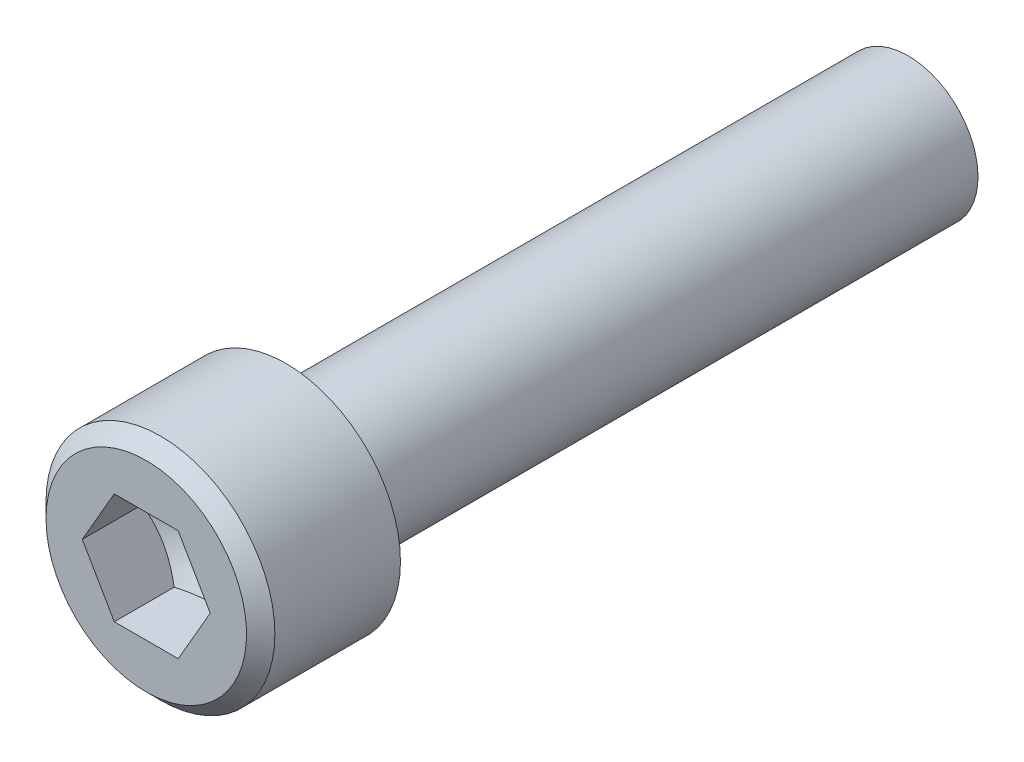
ISO-10303-21;
HEADER;
FILE_DESCRIPTION(('STEP AP214'),'2;1');
FILE_NAME('part.step','',(''),(''),'','','');
FILE_SCHEMA(('AUTOMOTIVE_DESIGN { 1 0 10303 214 1 1 1 1 }'));
ENDSEC;
DATA;
#1=APPLICATION_CONTEXT('core data for automotive mechanical design processes');
#2=APPLICATION_PROTOCOL_DEFINITION('international standard','automotive_design',2000,#1);
#3=PRODUCT_CONTEXT('',#1,'mechanical');
#4=PRODUCT('Part','Part','',(#3));
#5=PRODUCT_RELATED_PRODUCT_CATEGORY('part','',(#4));
#6=PRODUCT_DEFINITION_FORMATION('','',#4);
#7=PRODUCT_DEFINITION_CONTEXT('part definition',#1,'design');
#8=PRODUCT_DEFINITION('design','',#6,#7);
#9=PRODUCT_DEFINITION_SHAPE('','',#8);
#10=(LENGTH_UNIT() NAMED_UNIT(*) SI_UNIT(.MILLI.,.METRE.));
#11=(NAMED_UNIT(*) PLANE_ANGLE_UNIT() SI_UNIT($,.RADIAN.));
#12=(NAMED_UNIT(*) SI_UNIT($,.STERADIAN.) SOLID_ANGLE_UNIT());
#13=UNCERTAINTY_MEASURE_WITH_UNIT(LENGTH_MEASURE(1.E-05),#10,'distance_accuracy_value','');
#14=(GEOMETRIC_REPRESENTATION_CONTEXT(3) GLOBAL_UNCERTAINTY_ASSIGNED_CONTEXT((#13)) GLOBAL_UNIT_ASSIGNED_CONTEXT((#10,
#11,#12)) REPRESENTATION_CONTEXT('',''));
#15=CARTESIAN_POINT('',(0.,0.,0.));
#16=DIRECTION('',(0.,0.,1.));
#17=DIRECTION('',(1.,0.,0.));
#18=AXIS2_PLACEMENT_3D('',#15,#16,#17);
#19=CARTESIAN_POINT('',(0.,0.,2.00922230834522));
#20=DIRECTION('',(0.,0.,1.));
#21=DIRECTION('',(1.,0.,0.));
#22=AXIS2_PLACEMENT_3D('',#19,#20,#21);
#23=CONICAL_SURFACE('',#22,1.61357492368097,1.04719755087501);
#24=CARTESIAN_POINT('',(2.8421709430404E-10,0.,1.07762439154158));
#25=VERTEX_POINT('',#24);
#26=VERTEX_LOOP('',#25);
#27=FACE_BOUND('',#26,.T.);
#28=CARTESIAN_POINT('',(1.60395121657074,-3.93231520287804E-11,2.00366605844938));
#29=CARTESIAN_POINT('',(1.56870924553933,-0.0610408844234655,1.98331319876982));
#30=CARTESIAN_POINT('',(1.53316306631527,-0.122608672854029,1.96480333807968));
#31=CARTESIAN_POINT('',(1.46145524955302,-0.24681025478575,1.93249493217423));
#32=CARTESIAN_POINT('',(1.42529233832048,-0.309446254390239,1.91870781520045));
#33=CARTESIAN_POINT('',(1.35341466465201,-0.433942037113966,1.89724717363123));
#34=CARTESIAN_POINT('',(1.3177109584191,-0.495782670327854,1.88943079992379));
#35=CARTESIAN_POINT('',(1.24613563586373,-0.619754765561854,1.88010142592249));
#36=CARTESIAN_POINT('',(1.2102642795196,-0.681885777286306,1.87858069824715));
#37=CARTESIAN_POINT('',(1.14324250260176,-0.79797090012157,1.88175241126181));
#38=CARTESIAN_POINT('',(1.11208202485472,-0.851942430767562,1.88566609057263));
#39=CARTESIAN_POINT('',(1.04996406966679,-0.95953388521534,1.89806764845493));
#40=CARTESIAN_POINT('',(1.01900680691482,-1.013153437165,1.90655975922625));
#41=CARTESIAN_POINT('',(0.956760882889259,-1.12096654014135,1.92778839251887));
#42=CARTESIAN_POINT('',(0.925480095700149,-1.17514645285364,1.94061485982907));
#43=CARTESIAN_POINT('',(0.863384939234646,-1.28269841875583,1.96972551820593));
#44=CARTESIAN_POINT('',(0.832569775061635,-1.33607184874706,1.98600287381941));
#45=CARTESIAN_POINT('',(0.801975658015311,-1.389062413884,2.00366602975759));
#46=B_SPLINE_CURVE_WITH_KNOTS('',3,(#28,#29,#30,#31,#32,#33,#34,#35,#36,#37,#38,#39,#40,#41,#42,
#43,#44,#45),.UNSPECIFIED.,.F.,.F.,(4,2,2,2,2,2,2,2,4),(0.,0.220177526699982,0.440884143066922,
0.656128954539431,0.871109492448446,1.05826264577387,1.24558909665781,1.43706954981636,
1.62817420782779),.UNSPECIFIED.);
#47=CARTESIAN_POINT('',(1.60395121651482,0.,2.00366605835813));
#48=VERTEX_POINT('',#47);
#49=CARTESIAN_POINT('',(0.801975633155763,-1.389062456942,2.00366604411025));
#50=VERTEX_POINT('',#49);
#51=EDGE_CURVE('E21',#48,#50,#46,.T.);
#52=ORIENTED_EDGE('',*,*,#51,.F.);
#53=CARTESIAN_POINT('',(1.60395121657095,3.83074814970818E-11,2.00366605844988));
#54=CARTESIAN_POINT('',(1.56870924552077,0.0610408844553845,1.98331319875935));
#55=CARTESIAN_POINT('',(1.53316306627758,0.122608672919246,1.96480333806014));
#56=CARTESIAN_POINT('',(1.46145524947397,0.246810254922725,1.93249493214117));
#57=CARTESIAN_POINT('',(1.42529233821916,0.309446254565738,1.91870781516328));
#58=CARTESIAN_POINT('',(1.3534146645473,0.433942037295318,1.89724717360671));
#59=CARTESIAN_POINT('',(1.31771095833377,0.495782670475642,1.88943079990936));
#60=CARTESIAN_POINT('',(1.24613563582068,0.619754765636425,1.88010142592018));
#61=CARTESIAN_POINT('',(1.21026427949945,0.681885777321209,1.87858069824653));
#62=CARTESIAN_POINT('',(1.14324249767597,0.797970908653282,1.88175241149628));
#63=CARTESIAN_POINT('',(1.11208201501096,0.851942447817442,1.88566609181346));
#64=CARTESIAN_POINT('',(1.04996405006882,0.959533919160014,1.898067653093));
#65=CARTESIAN_POINT('',(1.0190067824808,1.01315347948597,1.90655976625848));
#66=CARTESIAN_POINT('',(0.956760848671186,1.12096659940879,1.92778840552082));
#67=CARTESIAN_POINT('',(0.925480056538882,1.17514652068294,1.94061487644981));
#68=CARTESIAN_POINT('',(0.863384890366848,1.28269850339733,1.9697255428513));
#69=CARTESIAN_POINT('',(0.832569721429848,1.33607194164004,1.98600290286582));
#70=CARTESIAN_POINT('',(0.80197559968634,1.38906251491274,2.00366606343383));
#71=B_SPLINE_CURVE_WITH_KNOTS('',3,(#53,#54,#55,#56,#57,#58,#59,#60,#61,#62,#63,#64,#65,#66,#67,
#68,#69,#70),.UNSPECIFIED.,.F.,.F.,(4,2,2,2,2,2,2,2,4),(0.,0.22017752681814,0.440884143318391,
0.656128954670925,0.871109492448965,1.05826267532404,1.24558915586695,1.43706964022464,
1.62817432919767),.UNSPECIFIED.);
#72=CARTESIAN_POINT('',(0.801975603520193,1.38906250827231,2.00366606122035));
#73=VERTEX_POINT('',#72);
#74=EDGE_CURVE('E86',#48,#73,#71,.T.);
#75=ORIENTED_EDGE('',*,*,#74,.T.);
#76=CARTESIAN_POINT('',(0.801975572332661,1.3890625,2.00366604808113));
#77=CARTESIAN_POINT('',(0.731491630827418,1.3890625,1.98331318923872));
#78=CARTESIAN_POINT('',(0.660399272939518,1.3890625,1.96480332944128));
#79=CARTESIAN_POINT('',(0.516983640587039,1.3890625,1.93249492539564));
#80=CARTESIAN_POINT('',(0.444657818734046,1.3890625,1.91870780938823));
#81=CARTESIAN_POINT('',(0.300902472702479,1.3890625,1.89724716975661));
#82=CARTESIAN_POINT('',(0.229495060928604,1.3890625,1.88943079701753));
#83=CARTESIAN_POINT('',(0.0863444172851924,1.3890625,1.88010142487821));
#84=CARTESIAN_POINT('',(0.0146017053721718,1.3890625,1.87858069809685));
#85=CARTESIAN_POINT('',(-0.119441855224592,1.3890625,1.88175241282815));
#86=CARTESIAN_POINT('',(-0.181762818246063,1.3890625,1.88566609362759));
#87=CARTESIAN_POINT('',(-0.305998743505769,1.3890625,1.89806765548551));
#88=CARTESIAN_POINT('',(-0.36791327636582,1.3890625,1.90655976874626));
#89=CARTESIAN_POINT('',(-0.492405139270699,1.3890625,1.92778840784305));
#90=CARTESIAN_POINT('',(-0.55496672113869,1.3890625,1.94061487849877));
#91=CARTESIAN_POINT('',(-0.679157048763347,1.3890625,1.96972554406884));
#92=CARTESIAN_POINT('',(-0.740787384314304,1.3890625,1.98600290352636));
#93=CARTESIAN_POINT('',(-0.801975625514881,1.3890625,2.00366606343352));
#94=B_SPLINE_CURVE_WITH_KNOTS('',3,(#76,#77,#78,#79,#80,#81,#82,#83,#84,#85,#86,#87,#88,#89,#90,
#91,#92,#93),.UNSPECIFIED.,.F.,.F.,(4,2,2,2,2,2,2,2,4),(0.,0.220177524395235,0.440884138409889,
0.656128947501183,0.871109483041436,1.05826265911873,1.24558913283762,1.43706961000139,
1.62817429182646),.UNSPECIFIED.);
#95=CARTESIAN_POINT('',(-0.801975617847664,1.38906249999999,2.00366606122018));
#96=VERTEX_POINT('',#95);
#97=EDGE_CURVE('E110',#73,#96,#94,.T.);
#98=ORIENTED_EDGE('',*,*,#97,.T.);
#99=CARTESIAN_POINT('',(-0.801975626276859,1.38906246885661,2.00366604808179));
#100=CARTESIAN_POINT('',(-0.837217597026695,1.32802158495904,1.98331318924093));
#101=CARTESIAN_POINT('',(-0.872763775967825,1.26645379701807,1.96480332944475));
#102=CARTESIAN_POINT('',(-0.944471592137981,1.14225221611155,1.93249492540098));
#103=CARTESIAN_POINT('',(-0.98063450306121,1.07961621704293,1.91870780939412));
#104=CARTESIAN_POINT('',(-1.05251217607654,0.955120435450555,1.8972471697605));
#105=CARTESIAN_POINT('',(-1.08821588196637,0.893279802830876,1.88943079701986));
#106=CARTESIAN_POINT('',(-1.15979120379438,0.769307708856671,1.88010142487863));
#107=CARTESIAN_POINT('',(-1.1956625597543,0.707176697797693,1.87858069809695));
#108=CARTESIAN_POINT('',(-1.26268433932696,0.591091570364156,1.88175241279337));
#109=CARTESIAN_POINT('',(-1.29384482011013,0.537120034459436,1.88566609344389));
#110=CARTESIAN_POINT('',(-1.35596278129694,0.429528569621292,1.89806765479912));
#111=CARTESIAN_POINT('',(-1.38692004701152,0.375909012540234,1.90655976770563));
#112=CARTESIAN_POINT('',(-1.4491659770165,0.268095899207226,1.92778840591918));
#113=CARTESIAN_POINT('',(-1.4804467672192,0.213915981275251,1.94061487603949));
#114=CARTESIAN_POINT('',(-1.54254192959554,0.106364005135186,1.96972554042232));
#115=CARTESIAN_POINT('',(-1.57335709666624,0.0529905701250223,1.98600289922871));
#116=CARTESIAN_POINT('',(-1.60395121657162,3.60392163694603E-11,2.0036660584509));
#117=B_SPLINE_CURVE_WITH_KNOTS('',3,(#99,#100,#101,#102,#103,#104,#105,#106,#107,#108,#109,#110,
#111,#112,#113,#114,#115,#116),.UNSPECIFIED.,.F.,.F.,(4,2,2,2,2,2,2,2,4),(0.,0.220177524377925,
0.44088413837303,0.656128947482232,0.871109483042021,1.05826265474771,1.24558912407881,
1.43706959662696,1.62817427387154),.UNSPECIFIED.);
#118=CARTESIAN_POINT('',(-1.60395121667412,1.94474958337601E-11,2.00366605856033));
#119=VERTEX_POINT('',#118);
#120=EDGE_CURVE('E204',#96,#119,#117,.T.);
#121=ORIENTED_EDGE('',*,*,#120,.T.);
#122=CARTESIAN_POINT('',(-0.801975545805903,-1.38906253324149,2.00366610034259));
#123=CARTESIAN_POINT('',(-0.837217537376201,-1.32802166134192,1.98331322384176));
#124=CARTESIAN_POINT('',(-0.87276372600438,-1.26645387633831,1.96480335498118));
#125=CARTESIAN_POINT('',(-0.94447155170889,-1.14225229337312,1.93249494059084));
#126=CARTESIAN_POINT('',(-0.980634462454542,-1.07961628929142,1.91870782330784));
#127=CARTESIAN_POINT('',(-1.05251213761926,-0.955120500192236,1.89724717950107));
#128=CARTESIAN_POINT('',(-1.08821584576458,-0.893279865036186,1.88943080386541));
#129=CARTESIAN_POINT('',(-1.15979117156361,-0.769307765179402,1.88010142695925));
#130=CARTESIAN_POINT('',(-1.19566252924003,-0.707176750774704,1.87858069831366));
#131=CARTESIAN_POINT('',(-1.26268431290894,-0.59109161601293,1.88175241009377));
#132=CARTESIAN_POINT('',(-1.29384479603855,-0.537120076123377,1.8856660897217));
#133=CARTESIAN_POINT('',(-1.3559627618584,-0.429528603319139,1.89806764983324));
#134=CARTESIAN_POINT('',(-1.38692002985971,-0.375909042256496,1.90655976251606));
#135=CARTESIAN_POINT('',(-1.44916596465683,-0.268095920606171,1.92778840102818));
#136=CARTESIAN_POINT('',(-1.48044675736197,-0.213915998344159,1.94061487171226));
#137=CARTESIAN_POINT('',(-1.54254192470765,-0.106364013605571,1.96972553783737));
#138=CARTESIAN_POINT('',(-1.57335709424496,-0.0529905743274037,1.98600289782452));
#139=CARTESIAN_POINT('',(-1.60395121657306,-3.35542596660389E-11,2.00366605845173));
#140=B_SPLINE_CURVE_WITH_KNOTS('',3,(#122,#123,#124,#125,#126,#127,#128,#129,#130,#131,#132,
#133,#134,#135,#136,#137,#138,#139),.UNSPECIFIED.,.F.,.F.,(4,2,2,2,2,2,2,2,4),(0.,
0.220177537854373,0.440884164774705,0.65612898490866,0.871109531728061,1.0582627170637,
1.24558919990149,1.43706968745937,1.62817437987301),.UNSPECIFIED.);
#141=CARTESIAN_POINT('',(-0.801975558576624,-1.3890625,2.00366604411011));
#142=VERTEX_POINT('',#141);
#143=EDGE_CURVE('E125',#142,#119,#140,.T.);
#144=ORIENTED_EDGE('',*,*,#143,.F.);
#145=CARTESIAN_POINT('',(0.801975668346452,-1.38906246250606,2.00366610034524));
#146=CARTESIAN_POINT('',(0.731491726858987,-1.38906248653386,1.98331322385465));
#147=CARTESIAN_POINT('',(0.660399366709517,-1.38906249639085,1.96480335500192));
#148=CARTESIAN_POINT('',(0.516983727889385,-1.38906250361783,1.93249494062263));
#149=CARTESIAN_POINT('',(0.444657901828066,-1.38906250095775,1.91870782334253));
#150=CARTESIAN_POINT('',(0.30090254822708,-1.38906249906595,1.89724717952394));
#151=CARTESIAN_POINT('',(0.2294951330899,-1.38906249975102,1.88943080387923));
#152=CARTESIAN_POINT('',(0.0863444822814701,-1.38906250024869,1.88010142696181));
#153=CARTESIAN_POINT('',(0.014601766566663,-1.38906250006237,1.87858069831428));
#154=CARTESIAN_POINT('',(-0.11944179261487,-1.38906249994571,1.88175240989325));
#155=CARTESIAN_POINT('',(-0.181762750425798,-1.38906249998537,1.88566608866343));
#156=CARTESIAN_POINT('',(-0.305998665394859,-1.38906250001465,1.89806764587998));
#157=CARTESIAN_POINT('',(-0.367913193175539,-1.38906250000423,1.90655975652276));
#158=CARTESIAN_POINT('',(-0.492405046113857,-1.38906249999569,1.92778838994837));
#159=CARTESIAN_POINT('',(-0.554966623097846,-1.38906249999785,1.94061485754914));
#160=CARTESIAN_POINT('',(-0.679156941243086,-1.38906250000216,1.96972551683718));
#161=CARTESIAN_POINT('',(-0.740787272196769,-1.3890625000043,1.98600287307466));
#162=CARTESIAN_POINT('',(-0.801975508857035,-1.3890625,2.0036660297573));
#163=B_SPLINE_CURVE_WITH_KNOTS('',3,(#145,#146,#147,#148,#149,#150,#151,#152,#153,#154,#155,
#156,#157,#158,#159,#160,#161,#162),.UNSPECIFIED.,.F.,.F.,(4,2,2,2,2,2,2,2,4),(0.,
0.220177537754302,0.440884164561744,0.656128984798626,0.871109531730289,1.05826269189142,
1.24558914946159,1.43706961043964,1.62817427647582),.UNSPECIFIED.);
#164=EDGE_CURVE('E89',#50,#142,#163,.T.);
#165=ORIENTED_EDGE('',*,*,#164,.F.);
#166=EDGE_LOOP('',(#52,#75,#98,#121,#144,#165));
#167=FACE_BOUND('',#166,.T.);
#168=ADVANCED_FACE('F17',(#27,#167),#23,.F.);
#169=CARTESIAN_POINT('',(-1.60395121659243,0.,-15.876));
#170=DIRECTION('',(-0.866025403784438,-0.5,0.));
#171=DIRECTION('',(0.5,-0.866025403784438,0.));
#172=AXIS2_PLACEMENT_3D('',#169,#170,#171);
#173=PLANE('',#172);
#174=ORIENTED_EDGE('',*,*,#143,.T.);
#175=DIRECTION('',(0.,0.,1.));
#176=VECTOR('',#175,1.);
#177=CARTESIAN_POINT('',(-1.60395121658915,5.67536469209262E-12,-15.876));
#178=LINE('',#177,#176);
#179=CARTESIAN_POINT('',(-1.60395121658915,5.67579837296162E-12,3.50520000000001));
#180=VERTEX_POINT('',#179);
#181=EDGE_CURVE('E178',#119,#180,#178,.T.);
#182=ORIENTED_EDGE('',*,*,#181,.T.);
#183=DIRECTION('',(0.5,-0.866025403784439,0.));
#184=VECTOR('',#183,1.);
#185=CARTESIAN_POINT('',(-1.60395121659243,0.,3.5052));
#186=LINE('',#185,#184);
#187=CARTESIAN_POINT('',(-0.801975608296548,-1.38906249999971,3.5052));
#188=VERTEX_POINT('',#187);
#189=EDGE_CURVE('E174',#180,#188,#186,.T.);
#190=ORIENTED_EDGE('',*,*,#189,.T.);
#191=DIRECTION('',(0.,0.,1.));
#192=VECTOR('',#191,1.);
#193=CARTESIAN_POINT('',(-0.801975608296213,-1.3890625,-15.876));
#194=LINE('',#193,#192);
#195=EDGE_CURVE('E153',#188,#142,#194,.F.);
#196=ORIENTED_EDGE('',*,*,#195,.T.);
#197=EDGE_LOOP('',(#174,#182,#190,#196));
#198=FACE_BOUND('',#197,.T.);
#199=ADVANCED_FACE('F141',(#198),#173,.F.);
#200=CARTESIAN_POINT('',(-0.801975608296214,-1.3890625,-15.876));
#201=DIRECTION('',(0.,-1.,0.));
#202=DIRECTION('',(1.,0.,0.));
#203=AXIS2_PLACEMENT_3D('',#200,#201,#202);
#204=PLANE('',#203);
#205=ORIENTED_EDGE('',*,*,#164,.T.);
#206=ORIENTED_EDGE('',*,*,#195,.F.);
#207=DIRECTION('',(-1.,0.,0.));
#208=VECTOR('',#207,1.);
#209=CARTESIAN_POINT('',(0.,-1.38906250000001,3.5052));
#210=LINE('',#209,#208);
#211=CARTESIAN_POINT('',(0.801975608295964,-1.38906250000044,3.50520000000001));
#212=VERTEX_POINT('',#211);
#213=EDGE_CURVE('E177',#188,#212,#210,.F.);
#214=ORIENTED_EDGE('',*,*,#213,.T.);
#215=DIRECTION('',(0.,0.,1.));
#216=VECTOR('',#215,1.);
#217=CARTESIAN_POINT('',(0.801975608296215,-1.3890625,-15.876));
#218=LINE('',#217,#216);
#219=EDGE_CURVE('E100',#212,#50,#218,.F.);
#220=ORIENTED_EDGE('',*,*,#219,.T.);
#221=EDGE_LOOP('',(#205,#206,#214,#220));
#222=FACE_BOUND('',#221,.T.);
#223=ADVANCED_FACE('F138',(#222),#204,.F.);
#224=CARTESIAN_POINT('',(0.801975608296216,-1.3890625,-15.876));
#225=DIRECTION('',(0.866025403784439,-0.5,0.));
#226=DIRECTION('',(0.5,0.866025403784439,0.));
#227=AXIS2_PLACEMENT_3D('',#224,#225,#226);
#228=PLANE('',#227);
#229=ORIENTED_EDGE('',*,*,#51,.T.);
#230=ORIENTED_EDGE('',*,*,#219,.F.);
#231=DIRECTION('',(0.499999999999999,0.866025403784439,0.));
#232=VECTOR('',#231,1.);
#233=CARTESIAN_POINT('',(0.801975608296216,-1.3890625,3.5052));
#234=LINE('',#233,#232);
#235=CARTESIAN_POINT('',(1.60395121659421,-3.08534791623605E-12,3.5052));
#236=VERTEX_POINT('',#235);
#237=EDGE_CURVE('E97',#212,#236,#234,.T.);
#238=ORIENTED_EDGE('',*,*,#237,.T.);
#239=DIRECTION('',(0.,0.,1.));
#240=VECTOR('',#239,1.);
#241=CARTESIAN_POINT('',(1.60395121659243,0.,-15.876));
#242=LINE('',#241,#240);
#243=EDGE_CURVE('E94',#236,#48,#242,.F.);
#244=ORIENTED_EDGE('',*,*,#243,.T.);
#245=EDGE_LOOP('',(#229,#230,#238,#244));
#246=FACE_BOUND('',#245,.T.);
#247=ADVANCED_FACE('F95',(#246),#228,.F.);
#248=CARTESIAN_POINT('',(1.60395121659243,0.,-15.876));
#249=DIRECTION('',(0.866025403784438,0.5,0.));
#250=DIRECTION('',(-0.5,0.866025403784438,0.));
#251=AXIS2_PLACEMENT_3D('',#248,#249,#250);
#252=PLANE('',#251);
#253=ORIENTED_EDGE('',*,*,#74,.F.);
#254=ORIENTED_EDGE('',*,*,#243,.F.);
#255=DIRECTION('',(-0.5,0.866025403784438,0.));
#256=VECTOR('',#255,1.);
#257=CARTESIAN_POINT('',(1.60395121659243,0.,3.5052));
#258=LINE('',#257,#256);
#259=CARTESIAN_POINT('',(0.8019756051891,1.3890625,3.5052));
#260=VERTEX_POINT('',#259);
#261=EDGE_CURVE('E183',#236,#260,#258,.T.);
#262=ORIENTED_EDGE('',*,*,#261,.T.);
#263=DIRECTION('',(0.,0.,1.));
#264=VECTOR('',#263,1.);
#265=CARTESIAN_POINT('',(0.801975608296215,1.3890625,-15.876));
#266=LINE('',#265,#264);
#267=EDGE_CURVE('E103',#260,#73,#266,.F.);
#268=ORIENTED_EDGE('',*,*,#267,.T.);
#269=EDGE_LOOP('',(#253,#254,#262,#268));
#270=FACE_BOUND('',#269,.T.);
#271=ADVANCED_FACE('F102',(#270),#252,.F.);
#272=CARTESIAN_POINT('',(0.801975608296215,1.3890625,-15.876));
#273=DIRECTION('',(0.,1.,0.));
#274=DIRECTION('',(0.,0.,1.));
#275=AXIS2_PLACEMENT_3D('',#272,#273,#274);
#276=PLANE('',#275);
#277=ORIENTED_EDGE('',*,*,#97,.F.);
#278=ORIENTED_EDGE('',*,*,#267,.F.);
#279=DIRECTION('',(-1.,0.,0.));
#280=VECTOR('',#279,1.);
#281=CARTESIAN_POINT('',(0.,1.3890625,3.5052));
#282=LINE('',#281,#280);
#283=CARTESIAN_POINT('',(-0.801975609849683,1.38906249730931,3.50520000000001));
#284=VERTEX_POINT('',#283);
#285=EDGE_CURVE('E46',#260,#284,#282,.T.);
#286=ORIENTED_EDGE('',*,*,#285,.T.);
#287=DIRECTION('',(0.,0.,1.));
#288=VECTOR('',#287,1.);
#289=CARTESIAN_POINT('',(-0.801975608296228,1.38906249999998,-15.876));
#290=LINE('',#289,#288);
#291=EDGE_CURVE('E209',#284,#96,#290,.F.);
#292=ORIENTED_EDGE('',*,*,#291,.T.);
#293=EDGE_LOOP('',(#277,#278,#286,#292));
#294=FACE_BOUND('',#293,.T.);
#295=ADVANCED_FACE('F132',(#294),#276,.F.);
#296=CARTESIAN_POINT('',(-0.801975608296216,1.3890625,-15.876));
#297=DIRECTION('',(-0.866025403784439,0.5,0.));
#298=DIRECTION('',(-0.5,-0.866025403784439,0.));
#299=AXIS2_PLACEMENT_3D('',#296,#297,#298);
#300=PLANE('',#299);
#301=ORIENTED_EDGE('',*,*,#120,.F.);
#302=ORIENTED_EDGE('',*,*,#291,.F.);
#303=DIRECTION('',(-0.499999999999999,-0.866025403784439,0.));
#304=VECTOR('',#303,1.);
#305=CARTESIAN_POINT('',(-0.801975608296228,1.38906249999998,3.5052));
#306=LINE('',#305,#304);
#307=EDGE_CURVE('E167',#284,#180,#306,.T.);
#308=ORIENTED_EDGE('',*,*,#307,.T.);
#309=ORIENTED_EDGE('',*,*,#181,.F.);
#310=EDGE_LOOP('',(#301,#302,#308,#309));
#311=FACE_BOUND('',#310,.T.);
#312=ADVANCED_FACE('F210',(#311),#300,.F.);
#313=CARTESIAN_POINT('',(0.,1.3890625,3.5052));
#314=DIRECTION('',(0.,0.,-1.));
#315=DIRECTION('',(-1.,0.,0.));
#316=AXIS2_PLACEMENT_3D('',#313,#314,#315);
#317=PLANE('',#316);
#318=ORIENTED_EDGE('',*,*,#285,.F.);
#319=ORIENTED_EDGE('',*,*,#261,.F.);
#320=ORIENTED_EDGE('',*,*,#237,.F.);
#321=ORIENTED_EDGE('',*,*,#213,.F.);
#322=ORIENTED_EDGE('',*,*,#189,.F.);
#323=ORIENTED_EDGE('',*,*,#307,.F.);
#324=EDGE_LOOP('',(#318,#319,#320,#321,#322,#323));
#325=FACE_BOUND('',#324,.T.);
#326=CARTESIAN_POINT('',(0.,0.,3.50519999994958));
#327=DIRECTION('',(0.,0.,-1.));
#328=DIRECTION('',(-1.,0.,0.));
#329=AXIS2_PLACEMENT_3D('',#326,#327,#328);
#330=CIRCLE('',#329,2.51460000004045);
#331=CARTESIAN_POINT('',(-2.51460000004045,0.,3.50519999994958));
#332=VERTEX_POINT('',#331);
#333=EDGE_CURVE('E171',#332,#332,#330,.T.);
#334=ORIENTED_EDGE('',*,*,#333,.F.);
#335=EDGE_LOOP('',(#334));
#336=FACE_BOUND('',#335,.T.);
#337=ADVANCED_FACE('F214',(#325,#336),#317,.F.);
#338=CARTESIAN_POINT('',(0.,0.,3.14960000008568));
#339=DIRECTION('',(0.,0.,-1.));
#340=DIRECTION('',(-1.,0.,0.));
#341=AXIS2_PLACEMENT_3D('',#338,#339,#340);
#342=CONICAL_SURFACE('',#341,2.87019999990434,0.785398163397448);
#343=CARTESIAN_POINT('',(0.,0.,3.14959999999997));
#344=DIRECTION('',(0.,0.,1.));
#345=DIRECTION('',(1.,0.,0.));
#346=AXIS2_PLACEMENT_3D('',#343,#344,#345);
#347=CIRCLE('',#346,2.8702);
#348=CARTESIAN_POINT('',(2.8702,0.,3.14959999999997));
#349=VERTEX_POINT('',#348);
#350=EDGE_CURVE('E202',#349,#349,#347,.F.);
#351=ORIENTED_EDGE('',*,*,#350,.F.);
#352=EDGE_LOOP('',(#351));
#353=FACE_BOUND('',#352,.T.);
#354=ORIENTED_EDGE('',*,*,#333,.T.);
#355=EDGE_LOOP('',(#354));
#356=FACE_BOUND('',#355,.T.);
#357=ADVANCED_FACE('F218',(#353,#356),#342,.T.);
#358=CARTESIAN_POINT('',(0.,0.,1000.));
#359=DIRECTION('',(0.,0.,1.));
#360=DIRECTION('',(1.,0.,0.));
#361=AXIS2_PLACEMENT_3D('',#358,#359,#360);
#362=CYLINDRICAL_SURFACE('',#361,2.8702);
#363=ORIENTED_EDGE('',*,*,#350,.T.);
#364=EDGE_LOOP('',(#363));
#365=FACE_BOUND('',#364,.T.);
#366=CARTESIAN_POINT('',(0.,0.,0.));
#367=DIRECTION('',(0.,0.,1.));
#368=DIRECTION('',(1.,0.,0.));
#369=AXIS2_PLACEMENT_3D('',#366,#367,#368);
#370=CIRCLE('',#369,2.8702);
#371=CARTESIAN_POINT('',(2.8702,0.,0.));
#372=VERTEX_POINT('',#371);
#373=EDGE_CURVE('E198',#372,#372,#370,.T.);
#374=ORIENTED_EDGE('',*,*,#373,.T.);
#375=EDGE_LOOP('',(#374));
#376=FACE_BOUND('',#375,.T.);
#377=ADVANCED_FACE('F222',(#365,#376),#362,.T.);
#378=CARTESIAN_POINT('',(0.,1.28016,-15.875));
#379=DIRECTION('',(0.,0.,1.));
#380=DIRECTION('',(1.,0.,0.));
#381=AXIS2_PLACEMENT_3D('',#378,#379,#380);
#382=PLANE('',#381);
#383=CARTESIAN_POINT('',(0.,0.,-15.8749999999613));
#384=DIRECTION('',(0.,0.,1.));
#385=DIRECTION('',(0.,-1.,0.));
#386=AXIS2_PLACEMENT_3D('',#383,#384,#385);
#387=CIRCLE('',#386,1.28015999990794);
#388=CARTESIAN_POINT('',(0.,-1.28015999990794,-15.8749999999613));
#389=VERTEX_POINT('',#388);
#390=EDGE_CURVE('E195',#389,#389,#387,.T.);
#391=ORIENTED_EDGE('',*,*,#390,.F.);
#392=EDGE_LOOP('',(#391));
#393=FACE_BOUND('',#392,.T.);
#394=ADVANCED_FACE('F226',(#393),#382,.F.);
#395=CARTESIAN_POINT('',(0.,2.8702,0.));
#396=DIRECTION('',(0.,0.,1.));
#397=DIRECTION('',(1.,0.,0.));
#398=AXIS2_PLACEMENT_3D('',#395,#396,#397);
#399=PLANE('',#398);
#400=CARTESIAN_POINT('',(0.,0.,0.));
#401=DIRECTION('',(0.,0.,1.));
#402=DIRECTION('',(1.,0.,0.));
#403=AXIS2_PLACEMENT_3D('',#400,#401,#402);
#404=CIRCLE('',#403,1.7526);
#405=CARTESIAN_POINT('',(1.7526,0.,0.));
#406=VERTEX_POINT('',#405);
#407=EDGE_CURVE('E11',#406,#406,#404,.F.);
#408=ORIENTED_EDGE('',*,*,#407,.F.);
#409=EDGE_LOOP('',(#408));
#410=FACE_BOUND('',#409,.T.);
#411=ORIENTED_EDGE('',*,*,#373,.F.);
#412=EDGE_LOOP('',(#411));
#413=FACE_BOUND('',#412,.T.);
#414=ADVANCED_FACE('F230',(#410,#413),#399,.F.);
#415=CARTESIAN_POINT('',(0.,0.,-15.6022366386992));
#416=DIRECTION('',(0.,0.,1.));
#417=DIRECTION('',(0.,-1.,0.));
#418=AXIS2_PLACEMENT_3D('',#415,#416,#417);
#419=CONICAL_SURFACE('',#418,1.75260000003163,1.04719755117324);
#420=CARTESIAN_POINT('',(0.,0.,-15.6022366388242));
#421=DIRECTION('',(0.,0.,1.));
#422=DIRECTION('',(1.,0.,0.));
#423=AXIS2_PLACEMENT_3D('',#420,#421,#422);
#424=CIRCLE('',#423,1.7526);
#425=CARTESIAN_POINT('',(1.7526,0.,-15.6022366388242));
#426=VERTEX_POINT('',#425);
#427=EDGE_CURVE('E33',#426,#426,#424,.T.);
#428=ORIENTED_EDGE('',*,*,#427,.F.);
#429=EDGE_LOOP('',(#428));
#430=FACE_BOUND('',#429,.T.);
#431=ORIENTED_EDGE('',*,*,#390,.T.);
#432=EDGE_LOOP('',(#431));
#433=FACE_BOUND('',#432,.T.);
#434=ADVANCED_FACE('F234',(#430,#433),#419,.T.);
#435=CARTESIAN_POINT('',(0.,0.,1000.));
#436=DIRECTION('',(0.,0.,1.));
#437=DIRECTION('',(1.,0.,0.));
#438=AXIS2_PLACEMENT_3D('',#435,#436,#437);
#439=CYLINDRICAL_SURFACE('',#438,1.7526);
#440=ORIENTED_EDGE('',*,*,#407,.T.);
#441=EDGE_LOOP('',(#440));
#442=FACE_BOUND('',#441,.T.);
#443=ORIENTED_EDGE('',*,*,#427,.T.);
#444=EDGE_LOOP('',(#443));
#445=FACE_BOUND('',#444,.T.);
#446=ADVANCED_FACE('F238',(#442,#445),#439,.T.);
#447=CLOSED_SHELL('',(#168,#199,#223,#247,#271,#295,#312,#337,#357,#377,#394,#414,#434,#446));
#448=MANIFOLD_SOLID_BREP('B1',#447);
#449=ADVANCED_BREP_SHAPE_REPRESENTATION('',(#18,#448),#14);
#450=SHAPE_DEFINITION_REPRESENTATION(#9,#449);
ENDSEC;
END-ISO-10303-21;
